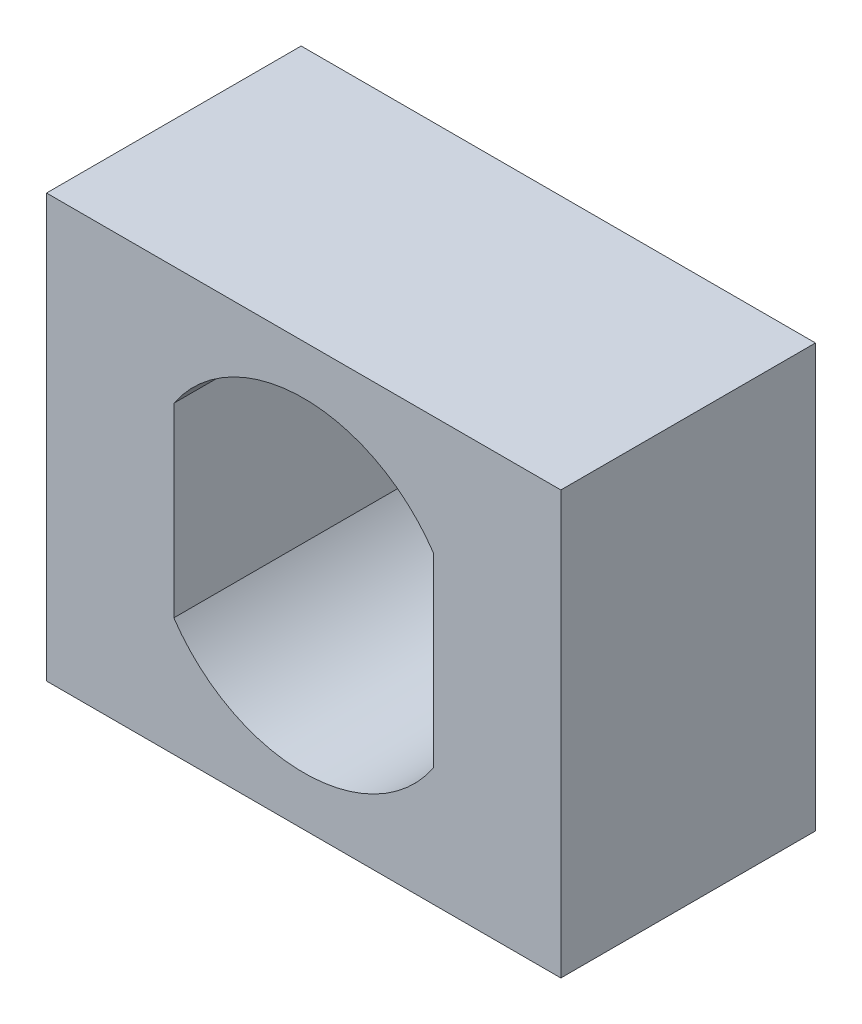
ISO-10303-21;
HEADER;
FILE_DESCRIPTION(('STEP AP214'),'2;1');
FILE_NAME('part.step','',(''),(''),'','','');
FILE_SCHEMA(('AUTOMOTIVE_DESIGN { 1 0 10303 214 1 1 1 1 }'));
ENDSEC;
DATA;
#1=APPLICATION_CONTEXT('core data for automotive mechanical design processes');
#2=APPLICATION_PROTOCOL_DEFINITION('international standard','automotive_design',2000,#1);
#3=PRODUCT_CONTEXT('',#1,'mechanical');
#4=PRODUCT('Part','Part','',(#3));
#5=PRODUCT_RELATED_PRODUCT_CATEGORY('part','',(#4));
#6=PRODUCT_DEFINITION_FORMATION('','',#4);
#7=PRODUCT_DEFINITION_CONTEXT('part definition',#1,'design');
#8=PRODUCT_DEFINITION('design','',#6,#7);
#9=PRODUCT_DEFINITION_SHAPE('','',#8);
#10=(LENGTH_UNIT() NAMED_UNIT(*) SI_UNIT(.MILLI.,.METRE.));
#11=(NAMED_UNIT(*) PLANE_ANGLE_UNIT() SI_UNIT($,.RADIAN.));
#12=(NAMED_UNIT(*) SI_UNIT($,.STERADIAN.) SOLID_ANGLE_UNIT());
#13=UNCERTAINTY_MEASURE_WITH_UNIT(LENGTH_MEASURE(1.E-05),#10,'distance_accuracy_value','');
#14=(GEOMETRIC_REPRESENTATION_CONTEXT(3) GLOBAL_UNCERTAINTY_ASSIGNED_CONTEXT((#13)) GLOBAL_UNIT_ASSIGNED_CONTEXT((#10,
#11,#12)) REPRESENTATION_CONTEXT('',''));
#15=CARTESIAN_POINT('',(0.,0.,0.));
#16=DIRECTION('',(0.,0.,1.));
#17=DIRECTION('',(1.,0.,0.));
#18=AXIS2_PLACEMENT_3D('',#15,#16,#17);
#19=CARTESIAN_POINT('',(10.1,8.3,10.));
#20=DIRECTION('',(-1.,0.,0.));
#21=DIRECTION('',(0.,-1.,0.));
#22=AXIS2_PLACEMENT_3D('',#19,#20,#21);
#23=PLANE('',#22);
#24=DIRECTION('',(0.,1.,0.));
#25=VECTOR('',#24,1.);
#26=CARTESIAN_POINT('',(10.1,8.3,0.));
#27=LINE('',#26,#25);
#28=CARTESIAN_POINT('',(10.1,-8.3,0.));
#29=VERTEX_POINT('',#28);
#30=CARTESIAN_POINT('',(10.1,8.3,0.));
#31=VERTEX_POINT('',#30);
#32=EDGE_CURVE('E130',#29,#31,#27,.T.);
#33=ORIENTED_EDGE('',*,*,#32,.T.);
#34=DIRECTION('',(0.,0.,-1.));
#35=VECTOR('',#34,1.);
#36=CARTESIAN_POINT('',(10.1,8.3,10.));
#37=LINE('',#36,#35);
#38=CARTESIAN_POINT('',(10.1,8.3,10.));
#39=VERTEX_POINT('',#38);
#40=EDGE_CURVE('E11',#39,#31,#37,.T.);
#41=ORIENTED_EDGE('',*,*,#40,.F.);
#42=DIRECTION('',(0.,1.,0.));
#43=VECTOR('',#42,1.);
#44=CARTESIAN_POINT('',(10.1,8.3,10.));
#45=LINE('',#44,#43);
#46=CARTESIAN_POINT('',(10.1,-8.3,10.));
#47=VERTEX_POINT('',#46);
#48=EDGE_CURVE('E134',#47,#39,#45,.T.);
#49=ORIENTED_EDGE('',*,*,#48,.F.);
#50=DIRECTION('',(0.,0.,-1.));
#51=VECTOR('',#50,1.);
#52=CARTESIAN_POINT('',(10.1,-8.3,10.));
#53=LINE('',#52,#51);
#54=EDGE_CURVE('E144',#47,#29,#53,.T.);
#55=ORIENTED_EDGE('',*,*,#54,.T.);
#56=EDGE_LOOP('',(#33,#41,#49,#55));
#57=FACE_BOUND('',#56,.T.);
#58=ADVANCED_FACE('F33',(#57),#23,.F.);
#59=CARTESIAN_POINT('',(-10.1,8.3,10.));
#60=DIRECTION('',(0.,-1.,0.));
#61=DIRECTION('',(0.,0.,-1.));
#62=AXIS2_PLACEMENT_3D('',#59,#60,#61);
#63=PLANE('',#62);
#64=DIRECTION('',(-1.,0.,0.));
#65=VECTOR('',#64,1.);
#66=CARTESIAN_POINT('',(-10.1,8.3,0.));
#67=LINE('',#66,#65);
#68=CARTESIAN_POINT('',(-10.1,8.3,0.));
#69=VERTEX_POINT('',#68);
#70=EDGE_CURVE('E147',#31,#69,#67,.T.);
#71=ORIENTED_EDGE('',*,*,#70,.T.);
#72=DIRECTION('',(0.,0.,-1.));
#73=VECTOR('',#72,1.);
#74=CARTESIAN_POINT('',(-10.1,8.3,10.));
#75=LINE('',#74,#73);
#76=CARTESIAN_POINT('',(-10.1,8.3,10.));
#77=VERTEX_POINT('',#76);
#78=EDGE_CURVE('E40',#77,#69,#75,.T.);
#79=ORIENTED_EDGE('',*,*,#78,.F.);
#80=DIRECTION('',(-1.,0.,0.));
#81=VECTOR('',#80,1.);
#82=CARTESIAN_POINT('',(-10.1,8.3,10.));
#83=LINE('',#82,#81);
#84=EDGE_CURVE('E137',#39,#77,#83,.T.);
#85=ORIENTED_EDGE('',*,*,#84,.F.);
#86=ORIENTED_EDGE('',*,*,#40,.T.);
#87=EDGE_LOOP('',(#71,#79,#85,#86));
#88=FACE_BOUND('',#87,.T.);
#89=ADVANCED_FACE('F175',(#88),#63,.F.);
#90=CARTESIAN_POINT('',(-10.1,8.3,10.));
#91=DIRECTION('',(1.,0.,0.));
#92=DIRECTION('',(0.,1.,0.));
#93=AXIS2_PLACEMENT_3D('',#90,#91,#92);
#94=PLANE('',#93);
#95=DIRECTION('',(0.,-1.,0.));
#96=VECTOR('',#95,1.);
#97=CARTESIAN_POINT('',(-10.1,8.3,0.));
#98=LINE('',#97,#96);
#99=CARTESIAN_POINT('',(-10.1,-8.3,0.));
#100=VERTEX_POINT('',#99);
#101=EDGE_CURVE('E149',#69,#100,#98,.T.);
#102=ORIENTED_EDGE('',*,*,#101,.T.);
#103=DIRECTION('',(0.,0.,-1.));
#104=VECTOR('',#103,1.);
#105=CARTESIAN_POINT('',(-10.1,-8.3,10.));
#106=LINE('',#105,#104);
#107=CARTESIAN_POINT('',(-10.1,-8.3,10.));
#108=VERTEX_POINT('',#107);
#109=EDGE_CURVE('E154',#108,#100,#106,.T.);
#110=ORIENTED_EDGE('',*,*,#109,.F.);
#111=DIRECTION('',(0.,-1.,0.));
#112=VECTOR('',#111,1.);
#113=CARTESIAN_POINT('',(-10.1,8.3,10.));
#114=LINE('',#113,#112);
#115=EDGE_CURVE('E140',#77,#108,#114,.T.);
#116=ORIENTED_EDGE('',*,*,#115,.F.);
#117=ORIENTED_EDGE('',*,*,#78,.T.);
#118=EDGE_LOOP('',(#102,#110,#116,#117));
#119=FACE_BOUND('',#118,.T.);
#120=ADVANCED_FACE('F161',(#119),#94,.F.);
#121=CARTESIAN_POINT('',(-10.1,-8.3,10.));
#122=DIRECTION('',(0.,1.,0.));
#123=DIRECTION('',(0.,0.,1.));
#124=AXIS2_PLACEMENT_3D('',#121,#122,#123);
#125=PLANE('',#124);
#126=DIRECTION('',(1.,0.,0.));
#127=VECTOR('',#126,1.);
#128=CARTESIAN_POINT('',(-10.1,-8.3,0.));
#129=LINE('',#128,#127);
#130=EDGE_CURVE('E138',#100,#29,#129,.T.);
#131=ORIENTED_EDGE('',*,*,#130,.T.);
#132=ORIENTED_EDGE('',*,*,#54,.F.);
#133=DIRECTION('',(1.,0.,0.));
#134=VECTOR('',#133,1.);
#135=CARTESIAN_POINT('',(-10.1,-8.3,10.));
#136=LINE('',#135,#134);
#137=EDGE_CURVE('E142',#108,#47,#136,.T.);
#138=ORIENTED_EDGE('',*,*,#137,.F.);
#139=ORIENTED_EDGE('',*,*,#109,.T.);
#140=EDGE_LOOP('',(#131,#132,#138,#139));
#141=FACE_BOUND('',#140,.T.);
#142=ADVANCED_FACE('F168',(#141),#125,.F.);
#143=CARTESIAN_POINT('',(0.,0.,10.));
#144=DIRECTION('',(0.,0.,1.));
#145=DIRECTION('',(1.,0.,0.));
#146=AXIS2_PLACEMENT_3D('',#143,#144,#145);
#147=PLANE('',#146);
#148=CARTESIAN_POINT('',(0.,-0.228750000000002,10.));
#149=DIRECTION('',(0.,0.,1.));
#150=DIRECTION('',(1.,0.,0.));
#151=AXIS2_PLACEMENT_3D('',#148,#149,#150);
#152=CIRCLE('',#151,6.14125);
#153=CARTESIAN_POINT('',(-5.1,-3.65,10.));
#154=VERTEX_POINT('',#153);
#155=CARTESIAN_POINT('',(5.1,-3.65,10.));
#156=VERTEX_POINT('',#155);
#157=EDGE_CURVE('E47',#154,#156,#152,.T.);
#158=ORIENTED_EDGE('',*,*,#157,.F.);
#159=DIRECTION('',(0.,-1.,0.));
#160=VECTOR('',#159,1.);
#161=CARTESIAN_POINT('',(-5.1,-3.65,10.));
#162=LINE('',#161,#160);
#163=CARTESIAN_POINT('',(-5.1,3.65,10.));
#164=VERTEX_POINT('',#163);
#165=EDGE_CURVE('E115',#164,#154,#162,.T.);
#166=ORIENTED_EDGE('',*,*,#165,.F.);
#167=CARTESIAN_POINT('',(0.,0.228750000000002,10.));
#168=DIRECTION('',(0.,0.,1.));
#169=DIRECTION('',(-1.,0.,0.));
#170=AXIS2_PLACEMENT_3D('',#167,#168,#169);
#171=CIRCLE('',#170,6.14125);
#172=CARTESIAN_POINT('',(5.1,3.65,10.));
#173=VERTEX_POINT('',#172);
#174=EDGE_CURVE('E118',#173,#164,#171,.T.);
#175=ORIENTED_EDGE('',*,*,#174,.F.);
#176=DIRECTION('',(0.,1.,0.));
#177=VECTOR('',#176,1.);
#178=CARTESIAN_POINT('',(5.1,3.65,10.));
#179=LINE('',#178,#177);
#180=EDGE_CURVE('E124',#156,#173,#179,.T.);
#181=ORIENTED_EDGE('',*,*,#180,.F.);
#182=EDGE_LOOP('',(#158,#166,#175,#181));
#183=FACE_BOUND('',#182,.T.);
#184=ORIENTED_EDGE('',*,*,#48,.T.);
#185=ORIENTED_EDGE('',*,*,#84,.T.);
#186=ORIENTED_EDGE('',*,*,#115,.T.);
#187=ORIENTED_EDGE('',*,*,#137,.T.);
#188=EDGE_LOOP('',(#184,#185,#186,#187));
#189=FACE_BOUND('',#188,.T.);
#190=ADVANCED_FACE('F174',(#183,#189),#147,.T.);
#191=CARTESIAN_POINT('',(0.,0.,0.));
#192=DIRECTION('',(0.,0.,1.));
#193=DIRECTION('',(1.,0.,0.));
#194=AXIS2_PLACEMENT_3D('',#191,#192,#193);
#195=PLANE('',#194);
#196=DIRECTION('',(0.,-1.,0.));
#197=VECTOR('',#196,1.);
#198=CARTESIAN_POINT('',(-5.1,-3.65,0.));
#199=LINE('',#198,#197);
#200=CARTESIAN_POINT('',(-5.1,3.65,0.));
#201=VERTEX_POINT('',#200);
#202=CARTESIAN_POINT('',(-5.1,-3.65,0.));
#203=VERTEX_POINT('',#202);
#204=EDGE_CURVE('E105',#201,#203,#199,.T.);
#205=ORIENTED_EDGE('',*,*,#204,.T.);
#206=CARTESIAN_POINT('',(0.,-0.228750000000002,0.));
#207=DIRECTION('',(0.,0.,1.));
#208=DIRECTION('',(1.,0.,0.));
#209=AXIS2_PLACEMENT_3D('',#206,#207,#208);
#210=CIRCLE('',#209,6.14125);
#211=CARTESIAN_POINT('',(5.1,-3.65,0.));
#212=VERTEX_POINT('',#211);
#213=EDGE_CURVE('E99',#203,#212,#210,.T.);
#214=ORIENTED_EDGE('',*,*,#213,.T.);
#215=DIRECTION('',(0.,1.,0.));
#216=VECTOR('',#215,1.);
#217=CARTESIAN_POINT('',(5.1,3.65,0.));
#218=LINE('',#217,#216);
#219=CARTESIAN_POINT('',(5.1,3.65,0.));
#220=VERTEX_POINT('',#219);
#221=EDGE_CURVE('E108',#212,#220,#218,.T.);
#222=ORIENTED_EDGE('',*,*,#221,.T.);
#223=CARTESIAN_POINT('',(0.,0.228750000000002,0.));
#224=DIRECTION('',(0.,0.,1.));
#225=DIRECTION('',(-1.,0.,0.));
#226=AXIS2_PLACEMENT_3D('',#223,#224,#225);
#227=CIRCLE('',#226,6.14125);
#228=EDGE_CURVE('E55',#220,#201,#227,.T.);
#229=ORIENTED_EDGE('',*,*,#228,.T.);
#230=EDGE_LOOP('',(#205,#214,#222,#229));
#231=FACE_BOUND('',#230,.T.);
#232=ORIENTED_EDGE('',*,*,#32,.F.);
#233=ORIENTED_EDGE('',*,*,#130,.F.);
#234=ORIENTED_EDGE('',*,*,#101,.F.);
#235=ORIENTED_EDGE('',*,*,#70,.F.);
#236=EDGE_LOOP('',(#232,#233,#234,#235));
#237=FACE_BOUND('',#236,.T.);
#238=ADVANCED_FACE('F112',(#231,#237),#195,.F.);
#239=CARTESIAN_POINT('',(0.,-0.228750000000002,0.));
#240=DIRECTION('',(0.,0.,1.));
#241=DIRECTION('',(1.,0.,0.));
#242=AXIS2_PLACEMENT_3D('',#239,#240,#241);
#243=CYLINDRICAL_SURFACE('',#242,6.14125);
#244=ORIENTED_EDGE('',*,*,#157,.T.);
#245=DIRECTION('',(0.,0.,1.));
#246=VECTOR('',#245,1.);
#247=CARTESIAN_POINT('',(5.1,-3.65,0.));
#248=LINE('',#247,#246);
#249=EDGE_CURVE('E95',#212,#156,#248,.T.);
#250=ORIENTED_EDGE('',*,*,#249,.F.);
#251=ORIENTED_EDGE('',*,*,#213,.F.);
#252=DIRECTION('',(0.,0.,1.));
#253=VECTOR('',#252,1.);
#254=CARTESIAN_POINT('',(-5.1,-3.65,0.));
#255=LINE('',#254,#253);
#256=EDGE_CURVE('E128',#203,#154,#255,.T.);
#257=ORIENTED_EDGE('',*,*,#256,.T.);
#258=EDGE_LOOP('',(#244,#250,#251,#257));
#259=FACE_BOUND('',#258,.T.);
#260=ADVANCED_FACE('F97',(#259),#243,.F.);
#261=CARTESIAN_POINT('',(-5.1,-3.65,0.));
#262=DIRECTION('',(-1.,0.,0.));
#263=DIRECTION('',(0.,0.,1.));
#264=AXIS2_PLACEMENT_3D('',#261,#262,#263);
#265=PLANE('',#264);
#266=ORIENTED_EDGE('',*,*,#165,.T.);
#267=ORIENTED_EDGE('',*,*,#256,.F.);
#268=ORIENTED_EDGE('',*,*,#204,.F.);
#269=DIRECTION('',(0.,0.,1.));
#270=VECTOR('',#269,1.);
#271=CARTESIAN_POINT('',(-5.1,3.65,0.));
#272=LINE('',#271,#270);
#273=EDGE_CURVE('E131',#201,#164,#272,.T.);
#274=ORIENTED_EDGE('',*,*,#273,.T.);
#275=EDGE_LOOP('',(#266,#267,#268,#274));
#276=FACE_BOUND('',#275,.T.);
#277=ADVANCED_FACE('F192',(#276),#265,.F.);
#278=CARTESIAN_POINT('',(0.,0.228750000000002,0.));
#279=DIRECTION('',(0.,0.,1.));
#280=DIRECTION('',(1.,0.,0.));
#281=AXIS2_PLACEMENT_3D('',#278,#279,#280);
#282=CYLINDRICAL_SURFACE('',#281,6.14125);
#283=ORIENTED_EDGE('',*,*,#174,.T.);
#284=ORIENTED_EDGE('',*,*,#273,.F.);
#285=ORIENTED_EDGE('',*,*,#228,.F.);
#286=DIRECTION('',(0.,0.,1.));
#287=VECTOR('',#286,1.);
#288=CARTESIAN_POINT('',(5.1,3.65,0.));
#289=LINE('',#288,#287);
#290=EDGE_CURVE('E104',#220,#173,#289,.T.);
#291=ORIENTED_EDGE('',*,*,#290,.T.);
#292=EDGE_LOOP('',(#283,#284,#285,#291));
#293=FACE_BOUND('',#292,.T.);
#294=ADVANCED_FACE('F195',(#293),#282,.F.);
#295=CARTESIAN_POINT('',(5.1,3.65,0.));
#296=DIRECTION('',(1.,0.,0.));
#297=DIRECTION('',(0.,0.,-1.));
#298=AXIS2_PLACEMENT_3D('',#295,#296,#297);
#299=PLANE('',#298);
#300=ORIENTED_EDGE('',*,*,#180,.T.);
#301=ORIENTED_EDGE('',*,*,#290,.F.);
#302=ORIENTED_EDGE('',*,*,#221,.F.);
#303=ORIENTED_EDGE('',*,*,#249,.T.);
#304=EDGE_LOOP('',(#300,#301,#302,#303));
#305=FACE_BOUND('',#304,.T.);
#306=ADVANCED_FACE('F109',(#305),#299,.F.);
#307=CLOSED_SHELL('',(#58,#89,#120,#142,#190,#238,#260,#277,#294,#306));
#308=MANIFOLD_SOLID_BREP('B2',#307);
#309=ADVANCED_BREP_SHAPE_REPRESENTATION('',(#18,#308),#14);
#310=SHAPE_DEFINITION_REPRESENTATION(#9,#309);
ENDSEC;
END-ISO-10303-21;
